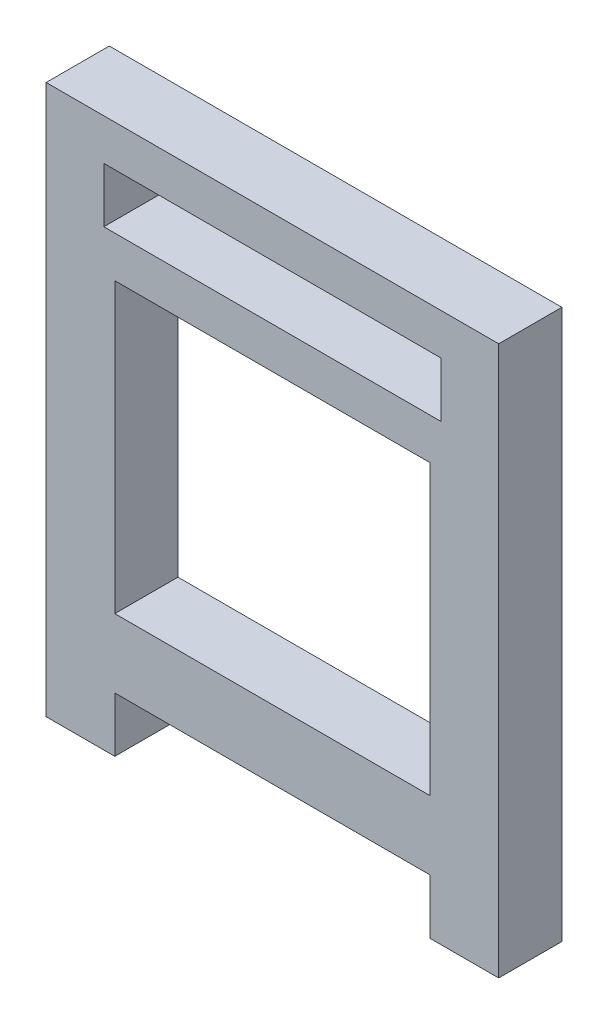
ISO-10303-21;
HEADER;
FILE_DESCRIPTION(('STEP AP214'),'2;1');
FILE_NAME('part.step','',(''),(''),'','','');
FILE_SCHEMA(('AUTOMOTIVE_DESIGN { 1 0 10303 214 1 1 1 1 }'));
ENDSEC;
DATA;
#1=APPLICATION_CONTEXT('core data for automotive mechanical design processes');
#2=APPLICATION_PROTOCOL_DEFINITION('international standard','automotive_design',2000,#1);
#3=PRODUCT_CONTEXT('',#1,'mechanical');
#4=PRODUCT('Part','Part','',(#3));
#5=PRODUCT_RELATED_PRODUCT_CATEGORY('part','',(#4));
#6=PRODUCT_DEFINITION_FORMATION('','',#4);
#7=PRODUCT_DEFINITION_CONTEXT('part definition',#1,'design');
#8=PRODUCT_DEFINITION('design','',#6,#7);
#9=PRODUCT_DEFINITION_SHAPE('','',#8);
#10=(LENGTH_UNIT() NAMED_UNIT(*) SI_UNIT(.MILLI.,.METRE.));
#11=(NAMED_UNIT(*) PLANE_ANGLE_UNIT() SI_UNIT($,.RADIAN.));
#12=(NAMED_UNIT(*) SI_UNIT($,.STERADIAN.) SOLID_ANGLE_UNIT());
#13=UNCERTAINTY_MEASURE_WITH_UNIT(LENGTH_MEASURE(1.E-05),#10,'distance_accuracy_value','');
#14=(GEOMETRIC_REPRESENTATION_CONTEXT(3) GLOBAL_UNCERTAINTY_ASSIGNED_CONTEXT((#13)) GLOBAL_UNIT_ASSIGNED_CONTEXT((#10,
#11,#12)) REPRESENTATION_CONTEXT('',''));
#15=CARTESIAN_POINT('',(0.,0.,0.));
#16=DIRECTION('',(0.,0.,1.));
#17=DIRECTION('',(1.,0.,0.));
#18=AXIS2_PLACEMENT_3D('',#15,#16,#17);
#19=CARTESIAN_POINT('',(0.,0.,2.3));
#20=DIRECTION('',(0.,0.,-1.));
#21=DIRECTION('',(-1.,0.,0.));
#22=AXIS2_PLACEMENT_3D('',#19,#20,#21);
#23=PLANE('',#22);
#24=DIRECTION('',(0.,1.,0.));
#25=VECTOR('',#24,1.);
#26=CARTESIAN_POINT('',(13.98,2.5,2.3));
#27=LINE('',#26,#25);
#28=CARTESIAN_POINT('',(13.98,2.5,2.3));
#29=VERTEX_POINT('',#28);
#30=CARTESIAN_POINT('',(13.98,13.,2.3));
#31=VERTEX_POINT('',#30);
#32=EDGE_CURVE('E188',#29,#31,#27,.T.);
#33=ORIENTED_EDGE('',*,*,#32,.F.);
#34=DIRECTION('',(1.,0.,0.));
#35=VECTOR('',#34,1.);
#36=CARTESIAN_POINT('',(2.5,2.5,2.3));
#37=LINE('',#36,#35);
#38=CARTESIAN_POINT('',(2.5,2.5,2.3));
#39=VERTEX_POINT('',#38);
#40=EDGE_CURVE('E196',#39,#29,#37,.T.);
#41=ORIENTED_EDGE('',*,*,#40,.F.);
#42=DIRECTION('',(0.,-1.,0.));
#43=VECTOR('',#42,1.);
#44=CARTESIAN_POINT('',(2.5,2.5,2.3));
#45=LINE('',#44,#43);
#46=CARTESIAN_POINT('',(2.5,13.,2.3));
#47=VERTEX_POINT('',#46);
#48=EDGE_CURVE('E193',#47,#39,#45,.T.);
#49=ORIENTED_EDGE('',*,*,#48,.F.);
#50=DIRECTION('',(-1.,0.,0.));
#51=VECTOR('',#50,1.);
#52=CARTESIAN_POINT('',(2.5,13.,2.3));
#53=LINE('',#52,#51);
#54=EDGE_CURVE('E190',#31,#47,#53,.T.);
#55=ORIENTED_EDGE('',*,*,#54,.F.);
#56=EDGE_LOOP('',(#33,#41,#49,#55));
#57=FACE_BOUND('',#56,.T.);
#58=DIRECTION('',(0.,-1.,0.));
#59=VECTOR('',#58,1.);
#60=CARTESIAN_POINT('',(0.,0.,2.3));
#61=LINE('',#60,#59);
#62=CARTESIAN_POINT('',(0.,18.,2.3));
#63=VERTEX_POINT('',#62);
#64=CARTESIAN_POINT('',(0.,-2.,2.3));
#65=VERTEX_POINT('',#64);
#66=EDGE_CURVE('E219',#63,#65,#61,.T.);
#67=ORIENTED_EDGE('',*,*,#66,.T.);
#68=DIRECTION('',(1.,0.,0.));
#69=VECTOR('',#68,1.);
#70=CARTESIAN_POINT('',(0.,-2.,2.3));
#71=LINE('',#70,#69);
#72=CARTESIAN_POINT('',(2.5,-2.,2.3));
#73=VERTEX_POINT('',#72);
#74=EDGE_CURVE('E221',#65,#73,#71,.T.);
#75=ORIENTED_EDGE('',*,*,#74,.T.);
#76=DIRECTION('',(0.,1.,0.));
#77=VECTOR('',#76,1.);
#78=CARTESIAN_POINT('',(2.5,-2.,2.3));
#79=LINE('',#78,#77);
#80=CARTESIAN_POINT('',(2.5,0.,2.3));
#81=VERTEX_POINT('',#80);
#82=EDGE_CURVE('E224',#73,#81,#79,.T.);
#83=ORIENTED_EDGE('',*,*,#82,.T.);
#84=DIRECTION('',(1.,0.,0.));
#85=VECTOR('',#84,1.);
#86=CARTESIAN_POINT('',(2.5,0.,2.3));
#87=LINE('',#86,#85);
#88=CARTESIAN_POINT('',(13.98,0.,2.3));
#89=VERTEX_POINT('',#88);
#90=EDGE_CURVE('E226',#81,#89,#87,.T.);
#91=ORIENTED_EDGE('',*,*,#90,.T.);
#92=DIRECTION('',(0.,-1.,0.));
#93=VECTOR('',#92,1.);
#94=CARTESIAN_POINT('',(13.98,-2.,2.3));
#95=LINE('',#94,#93);
#96=CARTESIAN_POINT('',(13.98,-2.,2.3));
#97=VERTEX_POINT('',#96);
#98=EDGE_CURVE('E228',#89,#97,#95,.T.);
#99=ORIENTED_EDGE('',*,*,#98,.T.);
#100=DIRECTION('',(1.,0.,0.));
#101=VECTOR('',#100,1.);
#102=CARTESIAN_POINT('',(16.48,-2.,2.3));
#103=LINE('',#102,#101);
#104=CARTESIAN_POINT('',(16.48,-2.,2.3));
#105=VERTEX_POINT('',#104);
#106=EDGE_CURVE('E230',#97,#105,#103,.T.);
#107=ORIENTED_EDGE('',*,*,#106,.T.);
#108=DIRECTION('',(0.,1.,0.));
#109=VECTOR('',#108,1.);
#110=CARTESIAN_POINT('',(16.48,0.,2.3));
#111=LINE('',#110,#109);
#112=CARTESIAN_POINT('',(16.48,18.,2.3));
#113=VERTEX_POINT('',#112);
#114=EDGE_CURVE('E232',#105,#113,#111,.T.);
#115=ORIENTED_EDGE('',*,*,#114,.T.);
#116=DIRECTION('',(-1.,0.,0.));
#117=VECTOR('',#116,1.);
#118=CARTESIAN_POINT('',(0.,18.,2.3));
#119=LINE('',#118,#117);
#120=EDGE_CURVE('E234',#113,#63,#119,.T.);
#121=ORIENTED_EDGE('',*,*,#120,.T.);
#122=EDGE_LOOP('',(#67,#75,#83,#91,#99,#107,#115,#121));
#123=FACE_BOUND('',#122,.T.);
#124=DIRECTION('',(0.,-1.,0.));
#125=VECTOR('',#124,1.);
#126=CARTESIAN_POINT('',(2.1,14.5,2.3));
#127=LINE('',#126,#125);
#128=CARTESIAN_POINT('',(2.1,16.5,2.3));
#129=VERTEX_POINT('',#128);
#130=CARTESIAN_POINT('',(2.1,14.5,2.3));
#131=VERTEX_POINT('',#130);
#132=EDGE_CURVE('E152',#129,#131,#127,.T.);
#133=ORIENTED_EDGE('',*,*,#132,.F.);
#134=DIRECTION('',(-1.,0.,0.));
#135=VECTOR('',#134,1.);
#136=CARTESIAN_POINT('',(2.1,16.5,2.3));
#137=LINE('',#136,#135);
#138=CARTESIAN_POINT('',(14.38,16.5,2.3));
#139=VERTEX_POINT('',#138);
#140=EDGE_CURVE('E174',#139,#129,#137,.T.);
#141=ORIENTED_EDGE('',*,*,#140,.F.);
#142=DIRECTION('',(0.,1.,0.));
#143=VECTOR('',#142,1.);
#144=CARTESIAN_POINT('',(14.38,14.5,2.3));
#145=LINE('',#144,#143);
#146=CARTESIAN_POINT('',(14.38,14.5,2.3));
#147=VERTEX_POINT('',#146);
#148=EDGE_CURVE('E172',#147,#139,#145,.T.);
#149=ORIENTED_EDGE('',*,*,#148,.F.);
#150=DIRECTION('',(1.,0.,0.));
#151=VECTOR('',#150,1.);
#152=CARTESIAN_POINT('',(2.1,14.5,2.3));
#153=LINE('',#152,#151);
#154=EDGE_CURVE('E160',#131,#147,#153,.T.);
#155=ORIENTED_EDGE('',*,*,#154,.F.);
#156=EDGE_LOOP('',(#133,#141,#149,#155));
#157=FACE_BOUND('',#156,.T.);
#158=ADVANCED_FACE('F39',(#57,#123,#157),#23,.F.);
#159=CARTESIAN_POINT('',(0.,0.,0.));
#160=DIRECTION('',(0.,0.,-1.));
#161=DIRECTION('',(-1.,0.,0.));
#162=AXIS2_PLACEMENT_3D('',#159,#160,#161);
#163=PLANE('',#162);
#164=DIRECTION('',(0.,-1.,0.));
#165=VECTOR('',#164,1.);
#166=CARTESIAN_POINT('',(0.,0.,0.));
#167=LINE('',#166,#165);
#168=CARTESIAN_POINT('',(0.,18.,0.));
#169=VERTEX_POINT('',#168);
#170=CARTESIAN_POINT('',(0.,-2.,0.));
#171=VERTEX_POINT('',#170);
#172=EDGE_CURVE('E218',#169,#171,#167,.T.);
#173=ORIENTED_EDGE('',*,*,#172,.F.);
#174=DIRECTION('',(-1.,0.,0.));
#175=VECTOR('',#174,1.);
#176=CARTESIAN_POINT('',(0.,18.,0.));
#177=LINE('',#176,#175);
#178=CARTESIAN_POINT('',(16.48,18.,0.));
#179=VERTEX_POINT('',#178);
#180=EDGE_CURVE('E222',#179,#169,#177,.T.);
#181=ORIENTED_EDGE('',*,*,#180,.F.);
#182=DIRECTION('',(0.,1.,0.));
#183=VECTOR('',#182,1.);
#184=CARTESIAN_POINT('',(16.48,0.,0.));
#185=LINE('',#184,#183);
#186=CARTESIAN_POINT('',(16.48,-2.,0.));
#187=VERTEX_POINT('',#186);
#188=EDGE_CURVE('E249',#187,#179,#185,.T.);
#189=ORIENTED_EDGE('',*,*,#188,.F.);
#190=DIRECTION('',(1.,0.,0.));
#191=VECTOR('',#190,1.);
#192=CARTESIAN_POINT('',(16.48,-2.,0.));
#193=LINE('',#192,#191);
#194=CARTESIAN_POINT('',(13.98,-2.,0.));
#195=VERTEX_POINT('',#194);
#196=EDGE_CURVE('E246',#195,#187,#193,.T.);
#197=ORIENTED_EDGE('',*,*,#196,.F.);
#198=DIRECTION('',(0.,-1.,0.));
#199=VECTOR('',#198,1.);
#200=CARTESIAN_POINT('',(13.98,-2.,0.));
#201=LINE('',#200,#199);
#202=CARTESIAN_POINT('',(13.98,0.,0.));
#203=VERTEX_POINT('',#202);
#204=EDGE_CURVE('E244',#203,#195,#201,.T.);
#205=ORIENTED_EDGE('',*,*,#204,.F.);
#206=DIRECTION('',(1.,0.,0.));
#207=VECTOR('',#206,1.);
#208=CARTESIAN_POINT('',(2.5,0.,0.));
#209=LINE('',#208,#207);
#210=CARTESIAN_POINT('',(2.5,0.,0.));
#211=VERTEX_POINT('',#210);
#212=EDGE_CURVE('E242',#211,#203,#209,.T.);
#213=ORIENTED_EDGE('',*,*,#212,.F.);
#214=DIRECTION('',(0.,1.,0.));
#215=VECTOR('',#214,1.);
#216=CARTESIAN_POINT('',(2.5,-2.,0.));
#217=LINE('',#216,#215);
#218=CARTESIAN_POINT('',(2.5,-2.,0.));
#219=VERTEX_POINT('',#218);
#220=EDGE_CURVE('E240',#219,#211,#217,.T.);
#221=ORIENTED_EDGE('',*,*,#220,.F.);
#222=DIRECTION('',(1.,0.,0.));
#223=VECTOR('',#222,1.);
#224=CARTESIAN_POINT('',(0.,-2.,0.));
#225=LINE('',#224,#223);
#226=EDGE_CURVE('E238',#171,#219,#225,.T.);
#227=ORIENTED_EDGE('',*,*,#226,.F.);
#228=EDGE_LOOP('',(#173,#181,#189,#197,#205,#213,#221,#227));
#229=FACE_BOUND('',#228,.T.);
#230=DIRECTION('',(1.,0.,0.));
#231=VECTOR('',#230,1.);
#232=CARTESIAN_POINT('',(2.5,2.5,0.));
#233=LINE('',#232,#231);
#234=CARTESIAN_POINT('',(2.5,2.5,0.));
#235=VERTEX_POINT('',#234);
#236=CARTESIAN_POINT('',(13.98,2.5,0.));
#237=VERTEX_POINT('',#236);
#238=EDGE_CURVE('E191',#235,#237,#233,.T.);
#239=ORIENTED_EDGE('',*,*,#238,.T.);
#240=DIRECTION('',(0.,1.,0.));
#241=VECTOR('',#240,1.);
#242=CARTESIAN_POINT('',(13.98,2.5,0.));
#243=LINE('',#242,#241);
#244=CARTESIAN_POINT('',(13.98,13.,0.));
#245=VERTEX_POINT('',#244);
#246=EDGE_CURVE('E168',#237,#245,#243,.T.);
#247=ORIENTED_EDGE('',*,*,#246,.T.);
#248=DIRECTION('',(-1.,0.,0.));
#249=VECTOR('',#248,1.);
#250=CARTESIAN_POINT('',(2.5,13.,0.));
#251=LINE('',#250,#249);
#252=CARTESIAN_POINT('',(2.5,13.,0.));
#253=VERTEX_POINT('',#252);
#254=EDGE_CURVE('E201',#245,#253,#251,.T.);
#255=ORIENTED_EDGE('',*,*,#254,.T.);
#256=DIRECTION('',(0.,-1.,0.));
#257=VECTOR('',#256,1.);
#258=CARTESIAN_POINT('',(2.5,2.5,0.));
#259=LINE('',#258,#257);
#260=EDGE_CURVE('E204',#253,#235,#259,.T.);
#261=ORIENTED_EDGE('',*,*,#260,.T.);
#262=EDGE_LOOP('',(#239,#247,#255,#261));
#263=FACE_BOUND('',#262,.T.);
#264=DIRECTION('',(-1.,0.,0.));
#265=VECTOR('',#264,1.);
#266=CARTESIAN_POINT('',(2.1,16.5,0.));
#267=LINE('',#266,#265);
#268=CARTESIAN_POINT('',(14.38,16.5,0.));
#269=VERTEX_POINT('',#268);
#270=CARTESIAN_POINT('',(2.1,16.5,0.));
#271=VERTEX_POINT('',#270);
#272=EDGE_CURVE('E161',#269,#271,#267,.T.);
#273=ORIENTED_EDGE('',*,*,#272,.T.);
#274=DIRECTION('',(0.,-1.,0.));
#275=VECTOR('',#274,1.);
#276=CARTESIAN_POINT('',(2.1,14.5,0.));
#277=LINE('',#276,#275);
#278=CARTESIAN_POINT('',(2.1,14.5,0.));
#279=VERTEX_POINT('',#278);
#280=EDGE_CURVE('E62',#271,#279,#277,.T.);
#281=ORIENTED_EDGE('',*,*,#280,.T.);
#282=DIRECTION('',(1.,0.,0.));
#283=VECTOR('',#282,1.);
#284=CARTESIAN_POINT('',(2.1,14.5,0.));
#285=LINE('',#284,#283);
#286=CARTESIAN_POINT('',(14.38,14.5,0.));
#287=VERTEX_POINT('',#286);
#288=EDGE_CURVE('E167',#279,#287,#285,.T.);
#289=ORIENTED_EDGE('',*,*,#288,.T.);
#290=DIRECTION('',(0.,1.,0.));
#291=VECTOR('',#290,1.);
#292=CARTESIAN_POINT('',(14.38,14.5,0.));
#293=LINE('',#292,#291);
#294=EDGE_CURVE('E180',#287,#269,#293,.T.);
#295=ORIENTED_EDGE('',*,*,#294,.T.);
#296=EDGE_LOOP('',(#273,#281,#289,#295));
#297=FACE_BOUND('',#296,.T.);
#298=ADVANCED_FACE('F281',(#229,#263,#297),#163,.T.);
#299=CARTESIAN_POINT('',(0.,0.,2.3));
#300=DIRECTION('',(1.,0.,0.));
#301=DIRECTION('',(0.,1.,0.));
#302=AXIS2_PLACEMENT_3D('',#299,#300,#301);
#303=PLANE('',#302);
#304=ORIENTED_EDGE('',*,*,#172,.T.);
#305=DIRECTION('',(0.,0.,-1.));
#306=VECTOR('',#305,1.);
#307=CARTESIAN_POINT('',(0.,-2.,2.3));
#308=LINE('',#307,#306);
#309=EDGE_CURVE('E11',#65,#171,#308,.T.);
#310=ORIENTED_EDGE('',*,*,#309,.F.);
#311=ORIENTED_EDGE('',*,*,#66,.F.);
#312=DIRECTION('',(0.,0.,-1.));
#313=VECTOR('',#312,1.);
#314=CARTESIAN_POINT('',(0.,18.,2.3));
#315=LINE('',#314,#313);
#316=EDGE_CURVE('E236',#63,#169,#315,.T.);
#317=ORIENTED_EDGE('',*,*,#316,.T.);
#318=EDGE_LOOP('',(#304,#310,#311,#317));
#319=FACE_BOUND('',#318,.T.);
#320=ADVANCED_FACE('F41',(#319),#303,.F.);
#321=CARTESIAN_POINT('',(0.,-2.,2.3));
#322=DIRECTION('',(0.,1.,0.));
#323=DIRECTION('',(0.,0.,1.));
#324=AXIS2_PLACEMENT_3D('',#321,#322,#323);
#325=PLANE('',#324);
#326=ORIENTED_EDGE('',*,*,#226,.T.);
#327=DIRECTION('',(0.,0.,-1.));
#328=VECTOR('',#327,1.);
#329=CARTESIAN_POINT('',(2.5,-2.,2.3));
#330=LINE('',#329,#328);
#331=EDGE_CURVE('E47',#73,#219,#330,.T.);
#332=ORIENTED_EDGE('',*,*,#331,.F.);
#333=ORIENTED_EDGE('',*,*,#74,.F.);
#334=ORIENTED_EDGE('',*,*,#309,.T.);
#335=EDGE_LOOP('',(#326,#332,#333,#334));
#336=FACE_BOUND('',#335,.T.);
#337=ADVANCED_FACE('F298',(#336),#325,.F.);
#338=CARTESIAN_POINT('',(2.5,-2.,2.3));
#339=DIRECTION('',(-1.,0.,0.));
#340=DIRECTION('',(0.,0.,1.));
#341=AXIS2_PLACEMENT_3D('',#338,#339,#340);
#342=PLANE('',#341);
#343=ORIENTED_EDGE('',*,*,#220,.T.);
#344=DIRECTION('',(0.,0.,-1.));
#345=VECTOR('',#344,1.);
#346=CARTESIAN_POINT('',(2.5,0.,2.3));
#347=LINE('',#346,#345);
#348=EDGE_CURVE('E267',#81,#211,#347,.T.);
#349=ORIENTED_EDGE('',*,*,#348,.F.);
#350=ORIENTED_EDGE('',*,*,#82,.F.);
#351=ORIENTED_EDGE('',*,*,#331,.T.);
#352=EDGE_LOOP('',(#343,#349,#350,#351));
#353=FACE_BOUND('',#352,.T.);
#354=ADVANCED_FACE('F274',(#353),#342,.F.);
#355=CARTESIAN_POINT('',(2.5,0.,2.3));
#356=DIRECTION('',(0.,1.,0.));
#357=DIRECTION('',(0.,0.,1.));
#358=AXIS2_PLACEMENT_3D('',#355,#356,#357);
#359=PLANE('',#358);
#360=ORIENTED_EDGE('',*,*,#212,.T.);
#361=DIRECTION('',(0.,0.,-1.));
#362=VECTOR('',#361,1.);
#363=CARTESIAN_POINT('',(13.98,0.,2.3));
#364=LINE('',#363,#362);
#365=EDGE_CURVE('E264',#89,#203,#364,.T.);
#366=ORIENTED_EDGE('',*,*,#365,.F.);
#367=ORIENTED_EDGE('',*,*,#90,.F.);
#368=ORIENTED_EDGE('',*,*,#348,.T.);
#369=EDGE_LOOP('',(#360,#366,#367,#368));
#370=FACE_BOUND('',#369,.T.);
#371=ADVANCED_FACE('F287',(#370),#359,.F.);
#372=CARTESIAN_POINT('',(13.98,-2.,2.3));
#373=DIRECTION('',(1.,0.,0.));
#374=DIRECTION('',(0.,0.,-1.));
#375=AXIS2_PLACEMENT_3D('',#372,#373,#374);
#376=PLANE('',#375);
#377=ORIENTED_EDGE('',*,*,#204,.T.);
#378=DIRECTION('',(0.,0.,-1.));
#379=VECTOR('',#378,1.);
#380=CARTESIAN_POINT('',(13.98,-2.,2.3));
#381=LINE('',#380,#379);
#382=EDGE_CURVE('E261',#97,#195,#381,.T.);
#383=ORIENTED_EDGE('',*,*,#382,.F.);
#384=ORIENTED_EDGE('',*,*,#98,.F.);
#385=ORIENTED_EDGE('',*,*,#365,.T.);
#386=EDGE_LOOP('',(#377,#383,#384,#385));
#387=FACE_BOUND('',#386,.T.);
#388=ADVANCED_FACE('F291',(#387),#376,.F.);
#389=CARTESIAN_POINT('',(16.48,-2.,2.3));
#390=DIRECTION('',(0.,1.,0.));
#391=DIRECTION('',(-1.,0.,0.));
#392=AXIS2_PLACEMENT_3D('',#389,#390,#391);
#393=PLANE('',#392);
#394=ORIENTED_EDGE('',*,*,#196,.T.);
#395=DIRECTION('',(0.,0.,-1.));
#396=VECTOR('',#395,1.);
#397=CARTESIAN_POINT('',(16.48,-2.,2.3));
#398=LINE('',#397,#396);
#399=EDGE_CURVE('E258',#105,#187,#398,.T.);
#400=ORIENTED_EDGE('',*,*,#399,.F.);
#401=ORIENTED_EDGE('',*,*,#106,.F.);
#402=ORIENTED_EDGE('',*,*,#382,.T.);
#403=EDGE_LOOP('',(#394,#400,#401,#402));
#404=FACE_BOUND('',#403,.T.);
#405=ADVANCED_FACE('F310',(#404),#393,.F.);
#406=CARTESIAN_POINT('',(16.48,0.,2.3));
#407=DIRECTION('',(-1.,0.,0.));
#408=DIRECTION('',(0.,0.,1.));
#409=AXIS2_PLACEMENT_3D('',#406,#407,#408);
#410=PLANE('',#409);
#411=ORIENTED_EDGE('',*,*,#188,.T.);
#412=DIRECTION('',(0.,0.,-1.));
#413=VECTOR('',#412,1.);
#414=CARTESIAN_POINT('',(16.48,18.,2.3));
#415=LINE('',#414,#413);
#416=EDGE_CURVE('E255',#113,#179,#415,.T.);
#417=ORIENTED_EDGE('',*,*,#416,.F.);
#418=ORIENTED_EDGE('',*,*,#114,.F.);
#419=ORIENTED_EDGE('',*,*,#399,.T.);
#420=EDGE_LOOP('',(#411,#417,#418,#419));
#421=FACE_BOUND('',#420,.T.);
#422=ADVANCED_FACE('F308',(#421),#410,.F.);
#423=CARTESIAN_POINT('',(0.,18.,2.3));
#424=DIRECTION('',(0.,-1.,0.));
#425=DIRECTION('',(0.,0.,-1.));
#426=AXIS2_PLACEMENT_3D('',#423,#424,#425);
#427=PLANE('',#426);
#428=ORIENTED_EDGE('',*,*,#180,.T.);
#429=ORIENTED_EDGE('',*,*,#316,.F.);
#430=ORIENTED_EDGE('',*,*,#120,.F.);
#431=ORIENTED_EDGE('',*,*,#416,.T.);
#432=EDGE_LOOP('',(#428,#429,#430,#431));
#433=FACE_BOUND('',#432,.T.);
#434=ADVANCED_FACE('F303',(#433),#427,.F.);
#435=CARTESIAN_POINT('',(13.98,2.5,2.3));
#436=DIRECTION('',(-1.,0.,0.));
#437=DIRECTION('',(0.,0.,1.));
#438=AXIS2_PLACEMENT_3D('',#435,#436,#437);
#439=PLANE('',#438);
#440=ORIENTED_EDGE('',*,*,#246,.F.);
#441=DIRECTION('',(0.,0.,-1.));
#442=VECTOR('',#441,1.);
#443=CARTESIAN_POINT('',(13.98,2.5,2.3));
#444=LINE('',#443,#442);
#445=EDGE_CURVE('E198',#29,#237,#444,.T.);
#446=ORIENTED_EDGE('',*,*,#445,.F.);
#447=ORIENTED_EDGE('',*,*,#32,.T.);
#448=DIRECTION('',(0.,0.,-1.));
#449=VECTOR('',#448,1.);
#450=CARTESIAN_POINT('',(13.98,13.,2.3));
#451=LINE('',#450,#449);
#452=EDGE_CURVE('E215',#31,#245,#451,.T.);
#453=ORIENTED_EDGE('',*,*,#452,.T.);
#454=EDGE_LOOP('',(#440,#446,#447,#453));
#455=FACE_BOUND('',#454,.T.);
#456=ADVANCED_FACE('F328',(#455),#439,.T.);
#457=CARTESIAN_POINT('',(2.5,13.,2.3));
#458=DIRECTION('',(0.,-1.,0.));
#459=DIRECTION('',(0.,0.,-1.));
#460=AXIS2_PLACEMENT_3D('',#457,#458,#459);
#461=PLANE('',#460);
#462=ORIENTED_EDGE('',*,*,#254,.F.);
#463=ORIENTED_EDGE('',*,*,#452,.F.);
#464=ORIENTED_EDGE('',*,*,#54,.T.);
#465=DIRECTION('',(0.,0.,-1.));
#466=VECTOR('',#465,1.);
#467=CARTESIAN_POINT('',(2.5,13.,2.3));
#468=LINE('',#467,#466);
#469=EDGE_CURVE('E213',#47,#253,#468,.T.);
#470=ORIENTED_EDGE('',*,*,#469,.T.);
#471=EDGE_LOOP('',(#462,#463,#464,#470));
#472=FACE_BOUND('',#471,.T.);
#473=ADVANCED_FACE('F335',(#472),#461,.T.);
#474=CARTESIAN_POINT('',(2.5,2.5,2.3));
#475=DIRECTION('',(1.,0.,0.));
#476=DIRECTION('',(0.,0.,-1.));
#477=AXIS2_PLACEMENT_3D('',#474,#475,#476);
#478=PLANE('',#477);
#479=ORIENTED_EDGE('',*,*,#260,.F.);
#480=ORIENTED_EDGE('',*,*,#469,.F.);
#481=ORIENTED_EDGE('',*,*,#48,.T.);
#482=DIRECTION('',(0.,0.,-1.));
#483=VECTOR('',#482,1.);
#484=CARTESIAN_POINT('',(2.5,2.5,2.3));
#485=LINE('',#484,#483);
#486=EDGE_CURVE('E211',#39,#235,#485,.T.);
#487=ORIENTED_EDGE('',*,*,#486,.T.);
#488=EDGE_LOOP('',(#479,#480,#481,#487));
#489=FACE_BOUND('',#488,.T.);
#490=ADVANCED_FACE('F340',(#489),#478,.T.);
#491=CARTESIAN_POINT('',(2.5,2.5,2.3));
#492=DIRECTION('',(0.,1.,0.));
#493=DIRECTION('',(0.,0.,1.));
#494=AXIS2_PLACEMENT_3D('',#491,#492,#493);
#495=PLANE('',#494);
#496=ORIENTED_EDGE('',*,*,#238,.F.);
#497=ORIENTED_EDGE('',*,*,#486,.F.);
#498=ORIENTED_EDGE('',*,*,#40,.T.);
#499=ORIENTED_EDGE('',*,*,#445,.T.);
#500=EDGE_LOOP('',(#496,#497,#498,#499));
#501=FACE_BOUND('',#500,.T.);
#502=ADVANCED_FACE('F346',(#501),#495,.T.);
#503=CARTESIAN_POINT('',(2.1,14.5,2.3));
#504=DIRECTION('',(1.,0.,0.));
#505=DIRECTION('',(0.,0.,-1.));
#506=AXIS2_PLACEMENT_3D('',#503,#504,#505);
#507=PLANE('',#506);
#508=ORIENTED_EDGE('',*,*,#280,.F.);
#509=DIRECTION('',(0.,0.,-1.));
#510=VECTOR('',#509,1.);
#511=CARTESIAN_POINT('',(2.1,16.5,2.3));
#512=LINE('',#511,#510);
#513=EDGE_CURVE('E156',#129,#271,#512,.T.);
#514=ORIENTED_EDGE('',*,*,#513,.F.);
#515=ORIENTED_EDGE('',*,*,#132,.T.);
#516=DIRECTION('',(0.,0.,-1.));
#517=VECTOR('',#516,1.);
#518=CARTESIAN_POINT('',(2.1,14.5,2.3));
#519=LINE('',#518,#517);
#520=EDGE_CURVE('E155',#131,#279,#519,.T.);
#521=ORIENTED_EDGE('',*,*,#520,.T.);
#522=EDGE_LOOP('',(#508,#514,#515,#521));
#523=FACE_BOUND('',#522,.T.);
#524=ADVANCED_FACE('F154',(#523),#507,.T.);
#525=CARTESIAN_POINT('',(2.1,14.5,2.3));
#526=DIRECTION('',(0.,1.,0.));
#527=DIRECTION('',(-1.,0.,0.));
#528=AXIS2_PLACEMENT_3D('',#525,#526,#527);
#529=PLANE('',#528);
#530=ORIENTED_EDGE('',*,*,#288,.F.);
#531=ORIENTED_EDGE('',*,*,#520,.F.);
#532=ORIENTED_EDGE('',*,*,#154,.T.);
#533=DIRECTION('',(0.,0.,-1.));
#534=VECTOR('',#533,1.);
#535=CARTESIAN_POINT('',(14.38,14.5,2.3));
#536=LINE('',#535,#534);
#537=EDGE_CURVE('E169',#147,#287,#536,.T.);
#538=ORIENTED_EDGE('',*,*,#537,.T.);
#539=EDGE_LOOP('',(#530,#531,#532,#538));
#540=FACE_BOUND('',#539,.T.);
#541=ADVANCED_FACE('F164',(#540),#529,.T.);
#542=CARTESIAN_POINT('',(14.38,14.5,2.3));
#543=DIRECTION('',(-1.,0.,0.));
#544=DIRECTION('',(0.,0.,1.));
#545=AXIS2_PLACEMENT_3D('',#542,#543,#544);
#546=PLANE('',#545);
#547=ORIENTED_EDGE('',*,*,#294,.F.);
#548=ORIENTED_EDGE('',*,*,#537,.F.);
#549=ORIENTED_EDGE('',*,*,#148,.T.);
#550=DIRECTION('',(0.,0.,-1.));
#551=VECTOR('',#550,1.);
#552=CARTESIAN_POINT('',(14.38,16.5,2.3));
#553=LINE('',#552,#551);
#554=EDGE_CURVE('E54',#139,#269,#553,.T.);
#555=ORIENTED_EDGE('',*,*,#554,.T.);
#556=EDGE_LOOP('',(#547,#548,#549,#555));
#557=FACE_BOUND('',#556,.T.);
#558=ADVANCED_FACE('F365',(#557),#546,.T.);
#559=CARTESIAN_POINT('',(2.1,16.5,2.3));
#560=DIRECTION('',(0.,-1.,0.));
#561=DIRECTION('',(0.,0.,-1.));
#562=AXIS2_PLACEMENT_3D('',#559,#560,#561);
#563=PLANE('',#562);
#564=ORIENTED_EDGE('',*,*,#272,.F.);
#565=ORIENTED_EDGE('',*,*,#554,.F.);
#566=ORIENTED_EDGE('',*,*,#140,.T.);
#567=ORIENTED_EDGE('',*,*,#513,.T.);
#568=EDGE_LOOP('',(#564,#565,#566,#567));
#569=FACE_BOUND('',#568,.T.);
#570=ADVANCED_FACE('F368',(#569),#563,.T.);
#571=CLOSED_SHELL('',(#158,#298,#320,#337,#354,#371,#388,#405,#422,#434,#456,#473,#490,#502,
#524,#541,#558,#570));
#572=MANIFOLD_SOLID_BREP('B2',#571);
#573=ADVANCED_BREP_SHAPE_REPRESENTATION('',(#18,#572),#14);
#574=SHAPE_DEFINITION_REPRESENTATION(#9,#573);
ENDSEC;
END-ISO-10303-21;
